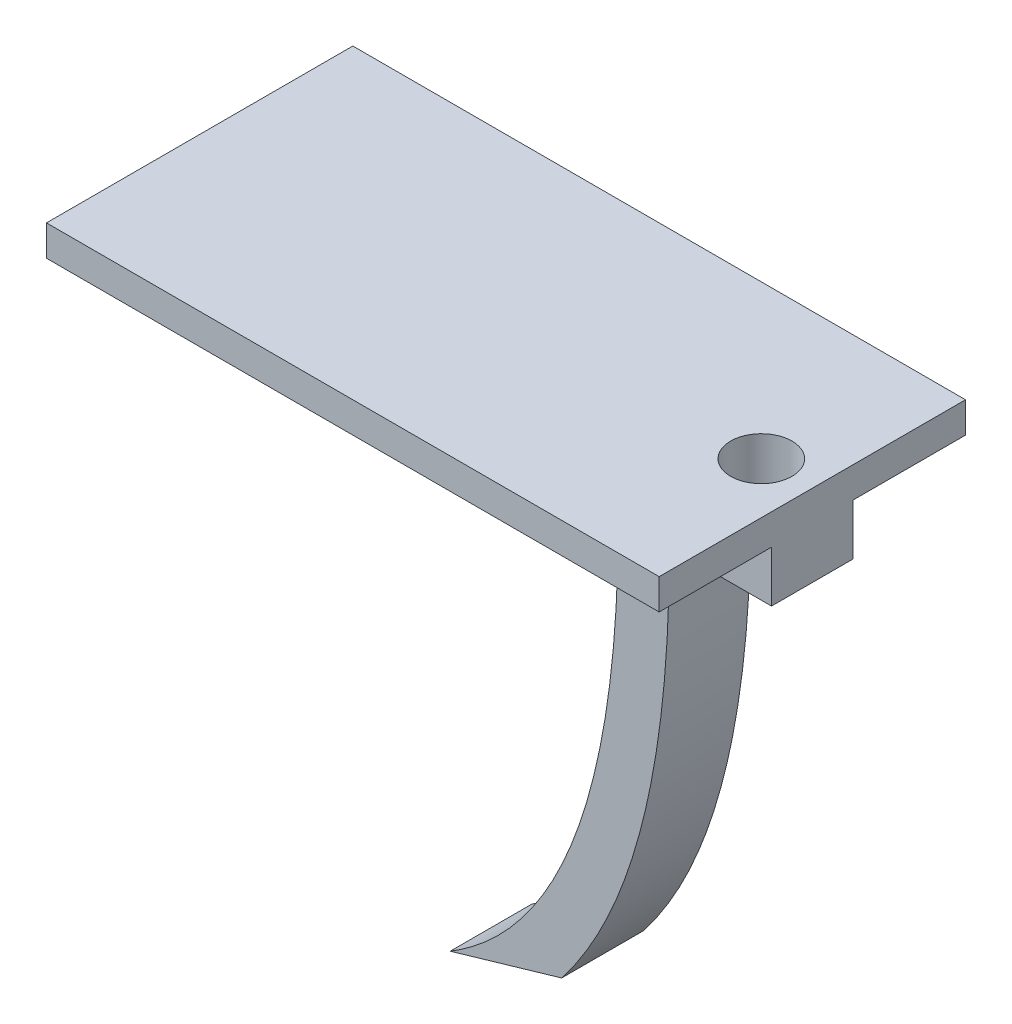
ISO-10303-21;
HEADER;
FILE_DESCRIPTION(('STEP AP214'),'2;1');
FILE_NAME('part.step','',(''),(''),'','','');
FILE_SCHEMA(('AUTOMOTIVE_DESIGN { 1 0 10303 214 1 1 1 1 }'));
ENDSEC;
DATA;
#1=APPLICATION_CONTEXT('core data for automotive mechanical design processes');
#2=APPLICATION_PROTOCOL_DEFINITION('international standard','automotive_design',2000,#1);
#3=PRODUCT_CONTEXT('',#1,'mechanical');
#4=PRODUCT('Part','Part','',(#3));
#5=PRODUCT_RELATED_PRODUCT_CATEGORY('part','',(#4));
#6=PRODUCT_DEFINITION_FORMATION('','',#4);
#7=PRODUCT_DEFINITION_CONTEXT('part definition',#1,'design');
#8=PRODUCT_DEFINITION('design','',#6,#7);
#9=PRODUCT_DEFINITION_SHAPE('','',#8);
#10=(LENGTH_UNIT() NAMED_UNIT(*) SI_UNIT(.MILLI.,.METRE.));
#11=(NAMED_UNIT(*) PLANE_ANGLE_UNIT() SI_UNIT($,.RADIAN.));
#12=(NAMED_UNIT(*) SI_UNIT($,.STERADIAN.) SOLID_ANGLE_UNIT());
#13=UNCERTAINTY_MEASURE_WITH_UNIT(LENGTH_MEASURE(1.E-05),#10,'distance_accuracy_value','');
#14=(GEOMETRIC_REPRESENTATION_CONTEXT(3) GLOBAL_UNCERTAINTY_ASSIGNED_CONTEXT((#13)) GLOBAL_UNIT_ASSIGNED_CONTEXT((#10,
#11,#12)) REPRESENTATION_CONTEXT('',''));
#15=CARTESIAN_POINT('',(0.,0.,0.));
#16=DIRECTION('',(0.,0.,1.));
#17=DIRECTION('',(1.,0.,0.));
#18=AXIS2_PLACEMENT_3D('',#15,#16,#17);
#19=CARTESIAN_POINT('',(20.0000000000017,2.85687025472644E-13,8.));
#20=CARTESIAN_POINT('',(20.0000000000017,-0.746108230917631,8.));
#21=CARTESIAN_POINT('',(19.988920632771,-2.24924380162013,8.));
#22=CARTESIAN_POINT('',(19.9222378712313,-5.16766695974469,8.));
#23=CARTESIAN_POINT('',(19.7549797981308,-8.71210314543152,8.));
#24=CARTESIAN_POINT('',(19.418395555301,-12.7821607544514,8.));
#25=CARTESIAN_POINT('',(18.7856392362467,-17.9733627474117,8.));
#26=CARTESIAN_POINT('',(17.6436358974673,-24.0214566580383,8.));
#27=CARTESIAN_POINT('',(15.6838246207657,-30.5843368041771,8.));
#28=CARTESIAN_POINT('',(13.0959183142866,-36.4498459385376,8.));
#29=CARTESIAN_POINT('',(8.74916418950321,-43.3101622539576,8.));
#30=CARTESIAN_POINT('',(4.43750224750601,-47.2647745701534,8.));
#31=CARTESIAN_POINT('',(1.12987064017376,-49.273588476404,8.));
#32=B_SPLINE_CURVE_WITH_KNOTS('',3,(#19,#20,#21,#22,#23,#24,#25,#26,#27,#28,#29,#30,#31),
.UNSPECIFIED.,.F.,.F.,(4,1,1,1,1,1,1,1,1,1,4),(0.,0.03125,0.0625,0.125,0.1875,0.25,0.375,0.5,
0.625,0.75,1.),.UNSPECIFIED.);
#33=DIRECTION('',(0.,0.,-1.));
#34=VECTOR('',#33,1.);
#35=SURFACE_OF_LINEAR_EXTRUSION('',#32,#34);
#36=CARTESIAN_POINT('',(20.0000000000017,3.03529895510736E-13,8.));
#37=VERTEX_POINT('',#36);
#38=CARTESIAN_POINT('',(9.44788574393022,-41.8145794293929,8.));
#39=VERTEX_POINT('',#38);
#40=EDGE_CURVE('E117',#37,#39,#32,.T.);
#41=ORIENTED_EDGE('',*,*,#40,.T.);
#42=DIRECTION('',(0.,0.,1.));
#43=VECTOR('',#42,1.);
#44=CARTESIAN_POINT('',(9.44788574393022,-41.8145794293929,-11.));
#45=LINE('',#44,#43);
#46=CARTESIAN_POINT('',(9.44788574393022,-41.8145794293929,0.));
#47=VERTEX_POINT('',#46);
#48=EDGE_CURVE('E202',#47,#39,#45,.T.);
#49=ORIENTED_EDGE('',*,*,#48,.F.);
#50=CARTESIAN_POINT('',(20.0000000000017,2.85687025472644E-13,0.));
#51=CARTESIAN_POINT('',(20.0000000000017,-0.746108230917631,0.));
#52=CARTESIAN_POINT('',(19.988920632771,-2.24924380162013,0.));
#53=CARTESIAN_POINT('',(19.9222378712313,-5.16766695974469,0.));
#54=CARTESIAN_POINT('',(19.7549797981308,-8.71210314543152,0.));
#55=CARTESIAN_POINT('',(19.418395555301,-12.7821607544514,0.));
#56=CARTESIAN_POINT('',(18.7856392362467,-17.9733627474117,0.));
#57=CARTESIAN_POINT('',(17.6436358974673,-24.0214566580383,0.));
#58=CARTESIAN_POINT('',(15.6838246207657,-30.5843368041771,0.));
#59=CARTESIAN_POINT('',(13.0959183142866,-36.4498459385376,0.));
#60=CARTESIAN_POINT('',(8.74916418950321,-43.3101622539576,0.));
#61=CARTESIAN_POINT('',(4.43750224750601,-47.2647745701534,0.));
#62=CARTESIAN_POINT('',(1.12987064017376,-49.273588476404,0.));
#63=B_SPLINE_CURVE_WITH_KNOTS('',3,(#50,#51,#52,#53,#54,#55,#56,#57,#58,#59,#60,#61,#62),
.UNSPECIFIED.,.F.,.F.,(4,1,1,1,1,1,1,1,1,1,4),(0.,0.03125,0.0625,0.125,0.1875,0.25,0.375,0.5,
0.625,0.75,1.),.UNSPECIFIED.);
#64=CARTESIAN_POINT('',(20.0000000000017,3.03529895510736E-13,0.));
#65=VERTEX_POINT('',#64);
#66=EDGE_CURVE('E161',#65,#47,#63,.T.);
#67=ORIENTED_EDGE('',*,*,#66,.F.);
#68=DIRECTION('',(0.,0.,-1.));
#69=VECTOR('',#68,1.);
#70=CARTESIAN_POINT('',(20.0000000000017,3.03529895510736E-13,8.));
#71=LINE('',#70,#69);
#72=EDGE_CURVE('E130',#37,#65,#71,.T.);
#73=ORIENTED_EDGE('',*,*,#72,.F.);
#74=EDGE_LOOP('',(#41,#49,#67,#73));
#75=FACE_BOUND('',#74,.T.);
#76=ADVANCED_FACE('F41',(#75),#35,.T.);
#77=CARTESIAN_POINT('',(0.,0.,8.));
#78=DIRECTION('',(0.,0.,1.));
#79=DIRECTION('',(1.,0.,0.));
#80=AXIS2_PLACEMENT_3D('',#77,#78,#79);
#81=PLANE('',#80);
#82=CARTESIAN_POINT('',(15.0000000000017,3.03529895511263E-13,8.));
#83=CARTESIAN_POINT('',(15.0000000000016,-34.9999999999997,8.));
#84=CARTESIAN_POINT('',(-1.46559493161567,-44.9999999999997,8.));
#85=B_SPLINE_CURVE_WITH_KNOTS('',2,(#82,#83,#84),.UNSPECIFIED.,.F.,.F.,(3,3),(0.,1.),.UNSPECIFIED.);
#86=CARTESIAN_POINT('',(15.0000000000017,3.03529895510737E-13,8.));
#87=VERTEX_POINT('',#86);
#88=CARTESIAN_POINT('',(-1.46559493161567,-44.9999999999997,8.));
#89=VERTEX_POINT('',#88);
#90=EDGE_CURVE('E100',#87,#89,#85,.T.);
#91=ORIENTED_EDGE('',*,*,#90,.T.);
#92=DIRECTION('',(0.959945080235453,0.280188227682303,0.));
#93=VECTOR('',#92,1.);
#94=CARTESIAN_POINT('',(11.9883818023932,-41.0730608719234,8.));
#95=LINE('',#94,#93);
#96=EDGE_CURVE('E208',#89,#39,#95,.T.);
#97=ORIENTED_EDGE('',*,*,#96,.T.);
#98=ORIENTED_EDGE('',*,*,#40,.F.);
#99=DIRECTION('',(1.,0.,0.));
#100=VECTOR('',#99,1.);
#101=CARTESIAN_POINT('',(0.,3.03529895510739E-13,8.));
#102=LINE('',#101,#100);
#103=CARTESIAN_POINT('',(30.0000000000017,3.03529895510735E-13,8.));
#104=VERTEX_POINT('',#103);
#105=EDGE_CURVE('E109',#37,#104,#102,.T.);
#106=ORIENTED_EDGE('',*,*,#105,.T.);
#107=DIRECTION('',(0.,1.,0.));
#108=VECTOR('',#107,1.);
#109=CARTESIAN_POINT('',(30.0000000000017,0.,8.));
#110=LINE('',#109,#108);
#111=CARTESIAN_POINT('',(30.0000000000017,5.0000000000003,8.));
#112=VERTEX_POINT('',#111);
#113=EDGE_CURVE('E113',#104,#112,#110,.T.);
#114=ORIENTED_EDGE('',*,*,#113,.T.);
#115=DIRECTION('',(1.,0.,0.));
#116=VECTOR('',#115,1.);
#117=CARTESIAN_POINT('',(0.,5.00000000000041,8.));
#118=LINE('',#117,#116);
#119=CARTESIAN_POINT('',(-29.9999999999983,5.00000000000052,8.));
#120=VERTEX_POINT('',#119);
#121=EDGE_CURVE('E139',#120,#112,#118,.T.);
#122=ORIENTED_EDGE('',*,*,#121,.F.);
#123=DIRECTION('',(0.,-1.,0.));
#124=VECTOR('',#123,1.);
#125=CARTESIAN_POINT('',(-29.9999999999983,0.,8.));
#126=LINE('',#125,#124);
#127=CARTESIAN_POINT('',(-29.9999999999983,3.03529895752389E-13,8.));
#128=VERTEX_POINT('',#127);
#129=EDGE_CURVE('E60',#120,#128,#126,.T.);
#130=ORIENTED_EDGE('',*,*,#129,.T.);
#131=EDGE_CURVE('E121',#128,#87,#102,.T.);
#132=ORIENTED_EDGE('',*,*,#131,.T.);
#133=EDGE_LOOP('',(#91,#97,#98,#106,#114,#122,#130,#132));
#134=FACE_BOUND('',#133,.T.);
#135=ADVANCED_FACE('F111',(#134),#81,.T.);
#136=CARTESIAN_POINT('',(0.,0.,0.));
#137=DIRECTION('',(0.,0.,1.));
#138=DIRECTION('',(1.,0.,0.));
#139=AXIS2_PLACEMENT_3D('',#136,#137,#138);
#140=PLANE('',#139);
#141=DIRECTION('',(0.959945080235453,0.280188227682303,0.));
#142=VECTOR('',#141,1.);
#143=CARTESIAN_POINT('',(11.9883818023932,-41.0730608719234,0.));
#144=LINE('',#143,#142);
#145=CARTESIAN_POINT('',(-1.46559493161567,-44.9999999999997,0.));
#146=VERTEX_POINT('',#145);
#147=EDGE_CURVE('E11',#146,#47,#144,.T.);
#148=ORIENTED_EDGE('',*,*,#147,.F.);
#149=CARTESIAN_POINT('',(15.0000000000017,3.03529895511263E-13,0.));
#150=CARTESIAN_POINT('',(15.0000000000016,-34.9999999999997,0.));
#151=CARTESIAN_POINT('',(-1.46559493161567,-44.9999999999997,0.));
#152=B_SPLINE_CURVE_WITH_KNOTS('',2,(#149,#150,#151),.UNSPECIFIED.,.F.,.F.,(3,3),(0.,1.),.UNSPECIFIED.);
#153=CARTESIAN_POINT('',(15.0000000000017,3.03529895510737E-13,0.));
#154=VERTEX_POINT('',#153);
#155=EDGE_CURVE('E154',#154,#146,#152,.T.);
#156=ORIENTED_EDGE('',*,*,#155,.F.);
#157=DIRECTION('',(1.,0.,0.));
#158=VECTOR('',#157,1.);
#159=CARTESIAN_POINT('',(0.,3.03529895510739E-13,0.));
#160=LINE('',#159,#158);
#161=CARTESIAN_POINT('',(-29.9999999999983,3.03529895752389E-13,0.));
#162=VERTEX_POINT('',#161);
#163=EDGE_CURVE('E150',#162,#154,#160,.T.);
#164=ORIENTED_EDGE('',*,*,#163,.F.);
#165=DIRECTION('',(0.,-1.,0.));
#166=VECTOR('',#165,1.);
#167=CARTESIAN_POINT('',(-29.9999999999983,0.,0.));
#168=LINE('',#167,#166);
#169=CARTESIAN_POINT('',(-29.9999999999983,5.00000000000052,0.));
#170=VERTEX_POINT('',#169);
#171=EDGE_CURVE('E87',#170,#162,#168,.T.);
#172=ORIENTED_EDGE('',*,*,#171,.F.);
#173=DIRECTION('',(1.,0.,0.));
#174=VECTOR('',#173,1.);
#175=CARTESIAN_POINT('',(0.,5.00000000000041,0.));
#176=LINE('',#175,#174);
#177=CARTESIAN_POINT('',(30.0000000000017,5.0000000000003,0.));
#178=VERTEX_POINT('',#177);
#179=EDGE_CURVE('E176',#170,#178,#176,.T.);
#180=ORIENTED_EDGE('',*,*,#179,.T.);
#181=DIRECTION('',(0.,1.,0.));
#182=VECTOR('',#181,1.);
#183=CARTESIAN_POINT('',(30.0000000000017,0.,0.));
#184=LINE('',#183,#182);
#185=CARTESIAN_POINT('',(30.0000000000017,3.03529895510735E-13,0.));
#186=VERTEX_POINT('',#185);
#187=EDGE_CURVE('E170',#186,#178,#184,.T.);
#188=ORIENTED_EDGE('',*,*,#187,.F.);
#189=EDGE_CURVE('E126',#65,#186,#160,.T.);
#190=ORIENTED_EDGE('',*,*,#189,.F.);
#191=ORIENTED_EDGE('',*,*,#66,.T.);
#192=EDGE_LOOP('',(#148,#156,#164,#172,#180,#188,#190,#191));
#193=FACE_BOUND('',#192,.T.);
#194=ADVANCED_FACE('F193',(#193),#140,.F.);
#195=CARTESIAN_POINT('',(0.,3.03529895510739E-13,8.));
#196=DIRECTION('',(0.,1.,0.));
#197=DIRECTION('',(-1.,0.,0.));
#198=AXIS2_PLACEMENT_3D('',#195,#196,#197);
#199=PLANE('',#198);
#200=ORIENTED_EDGE('',*,*,#163,.T.);
#201=DIRECTION('',(0.,0.,-1.));
#202=VECTOR('',#201,1.);
#203=CARTESIAN_POINT('',(15.0000000000017,3.03529895510737E-13,8.));
#204=LINE('',#203,#202);
#205=EDGE_CURVE('E52',#87,#154,#204,.T.);
#206=ORIENTED_EDGE('',*,*,#205,.F.);
#207=ORIENTED_EDGE('',*,*,#131,.F.);
#208=DIRECTION('',(0.,0.,-1.));
#209=VECTOR('',#208,1.);
#210=CARTESIAN_POINT('',(-29.9999999999983,3.03529895752389E-13,8.));
#211=LINE('',#210,#209);
#212=EDGE_CURVE('E131',#128,#162,#211,.T.);
#213=ORIENTED_EDGE('',*,*,#212,.T.);
#214=EDGE_LOOP('',(#200,#206,#207,#213));
#215=FACE_BOUND('',#214,.T.);
#216=ADVANCED_FACE('F191',(#215),#199,.F.);
#217=DIRECTION('',(0.,0.,-1.));
#218=VECTOR('',#217,1.);
#219=SURFACE_OF_LINEAR_EXTRUSION('',#85,#218);
#220=ORIENTED_EDGE('',*,*,#155,.T.);
#221=DIRECTION('',(0.,0.,-1.));
#222=VECTOR('',#221,1.);
#223=CARTESIAN_POINT('',(-1.46559493161567,-44.9999999999997,8.));
#224=LINE('',#223,#222);
#225=EDGE_CURVE('E185',#89,#146,#224,.T.);
#226=ORIENTED_EDGE('',*,*,#225,.F.);
#227=ORIENTED_EDGE('',*,*,#90,.F.);
#228=ORIENTED_EDGE('',*,*,#205,.T.);
#229=EDGE_LOOP('',(#220,#226,#227,#228));
#230=FACE_BOUND('',#229,.T.);
#231=ADVANCED_FACE('F43',(#230),#219,.F.);
#232=CARTESIAN_POINT('',(25.0000000000016,3.05311331771918E-13,4.));
#233=DIRECTION('',(0.,1.,0.));
#234=DIRECTION('',(-1.,0.,0.));
#235=AXIS2_PLACEMENT_3D('',#232,#233,#234);
#236=CIRCLE('',#235,2.99999999999999);
#237=CARTESIAN_POINT('',(22.0000000000017,3.05311331771919E-13,4.));
#238=VERTEX_POINT('',#237);
#239=EDGE_CURVE('E213',#238,#238,#236,.T.);
#240=ORIENTED_EDGE('',*,*,#239,.T.);
#241=EDGE_LOOP('',(#240));
#242=FACE_BOUND('',#241,.T.);
#243=ORIENTED_EDGE('',*,*,#189,.T.);
#244=DIRECTION('',(0.,0.,-1.));
#245=VECTOR('',#244,1.);
#246=CARTESIAN_POINT('',(30.0000000000017,3.03529895510735E-13,8.));
#247=LINE('',#246,#245);
#248=EDGE_CURVE('E123',#104,#186,#247,.T.);
#249=ORIENTED_EDGE('',*,*,#248,.F.);
#250=ORIENTED_EDGE('',*,*,#105,.F.);
#251=ORIENTED_EDGE('',*,*,#72,.T.);
#252=EDGE_LOOP('',(#243,#249,#250,#251));
#253=FACE_BOUND('',#252,.T.);
#254=ADVANCED_FACE('F124',(#242,#253),#199,.F.);
#255=CARTESIAN_POINT('',(30.0000000000017,0.,8.));
#256=DIRECTION('',(-1.,0.,0.));
#257=DIRECTION('',(0.,-1.,0.));
#258=AXIS2_PLACEMENT_3D('',#255,#256,#257);
#259=PLANE('',#258);
#260=ORIENTED_EDGE('',*,*,#187,.T.);
#261=DIRECTION('',(0.,0.,-1.));
#262=VECTOR('',#261,1.);
#263=CARTESIAN_POINT('',(30.0000000000017,5.0000000000003,19.));
#264=LINE('',#263,#262);
#265=CARTESIAN_POINT('',(30.0000000000017,5.0000000000003,-11.));
#266=VERTEX_POINT('',#265);
#267=EDGE_CURVE('E220',#178,#266,#264,.T.);
#268=ORIENTED_EDGE('',*,*,#267,.T.);
#269=DIRECTION('',(0.,-1.,0.));
#270=VECTOR('',#269,1.);
#271=CARTESIAN_POINT('',(30.0000000000017,8.0000000000003,-11.));
#272=LINE('',#271,#270);
#273=CARTESIAN_POINT('',(30.0000000000017,8.0000000000003,-11.));
#274=VERTEX_POINT('',#273);
#275=EDGE_CURVE('E155',#274,#266,#272,.T.);
#276=ORIENTED_EDGE('',*,*,#275,.F.);
#277=DIRECTION('',(0.,0.,-1.));
#278=VECTOR('',#277,1.);
#279=CARTESIAN_POINT('',(30.0000000000017,8.0000000000003,19.));
#280=LINE('',#279,#278);
#281=CARTESIAN_POINT('',(30.0000000000017,8.0000000000003,19.));
#282=VERTEX_POINT('',#281);
#283=EDGE_CURVE('E221',#282,#274,#280,.T.);
#284=ORIENTED_EDGE('',*,*,#283,.F.);
#285=DIRECTION('',(0.,-1.,0.));
#286=VECTOR('',#285,1.);
#287=CARTESIAN_POINT('',(30.0000000000017,8.0000000000003,19.));
#288=LINE('',#287,#286);
#289=CARTESIAN_POINT('',(30.0000000000017,5.0000000000003,19.));
#290=VERTEX_POINT('',#289);
#291=EDGE_CURVE('E238',#282,#290,#288,.T.);
#292=ORIENTED_EDGE('',*,*,#291,.T.);
#293=EDGE_CURVE('E137',#290,#112,#264,.T.);
#294=ORIENTED_EDGE('',*,*,#293,.T.);
#295=ORIENTED_EDGE('',*,*,#113,.F.);
#296=ORIENTED_EDGE('',*,*,#248,.T.);
#297=EDGE_LOOP('',(#260,#268,#276,#284,#292,#294,#295,#296));
#298=FACE_BOUND('',#297,.T.);
#299=ADVANCED_FACE('F134',(#298),#259,.F.);
#300=CARTESIAN_POINT('',(-29.9999999999983,0.,8.));
#301=DIRECTION('',(1.,0.,0.));
#302=DIRECTION('',(0.,0.,-1.));
#303=AXIS2_PLACEMENT_3D('',#300,#301,#302);
#304=PLANE('',#303);
#305=ORIENTED_EDGE('',*,*,#171,.T.);
#306=ORIENTED_EDGE('',*,*,#212,.F.);
#307=ORIENTED_EDGE('',*,*,#129,.F.);
#308=DIRECTION('',(0.,0.,1.));
#309=VECTOR('',#308,1.);
#310=CARTESIAN_POINT('',(-29.9999999999983,5.00000000000052,19.));
#311=LINE('',#310,#309);
#312=CARTESIAN_POINT('',(-29.9999999999983,5.00000000000052,19.));
#313=VERTEX_POINT('',#312);
#314=EDGE_CURVE('E245',#120,#313,#311,.T.);
#315=ORIENTED_EDGE('',*,*,#314,.T.);
#316=DIRECTION('',(0.,-1.,0.));
#317=VECTOR('',#316,1.);
#318=CARTESIAN_POINT('',(-29.9999999999983,8.00000000000052,19.));
#319=LINE('',#318,#317);
#320=CARTESIAN_POINT('',(-29.9999999999983,8.00000000000052,19.));
#321=VERTEX_POINT('',#320);
#322=EDGE_CURVE('E254',#321,#313,#319,.T.);
#323=ORIENTED_EDGE('',*,*,#322,.F.);
#324=DIRECTION('',(0.,0.,1.));
#325=VECTOR('',#324,1.);
#326=CARTESIAN_POINT('',(-29.9999999999983,8.00000000000052,19.));
#327=LINE('',#326,#325);
#328=CARTESIAN_POINT('',(-29.9999999999983,8.00000000000052,-11.));
#329=VERTEX_POINT('',#328);
#330=EDGE_CURVE('E230',#329,#321,#327,.T.);
#331=ORIENTED_EDGE('',*,*,#330,.F.);
#332=DIRECTION('',(0.,-1.,0.));
#333=VECTOR('',#332,1.);
#334=CARTESIAN_POINT('',(-29.9999999999983,8.00000000000052,-11.));
#335=LINE('',#334,#333);
#336=CARTESIAN_POINT('',(-29.9999999999983,5.00000000000052,-11.));
#337=VERTEX_POINT('',#336);
#338=EDGE_CURVE('E258',#329,#337,#335,.T.);
#339=ORIENTED_EDGE('',*,*,#338,.T.);
#340=EDGE_CURVE('E246',#337,#170,#311,.T.);
#341=ORIENTED_EDGE('',*,*,#340,.T.);
#342=EDGE_LOOP('',(#305,#306,#307,#315,#323,#331,#339,#341));
#343=FACE_BOUND('',#342,.T.);
#344=ADVANCED_FACE('F317',(#343),#304,.F.);
#345=CARTESIAN_POINT('',(0.,5.00000000000041,0.));
#346=DIRECTION('',(0.,-1.,0.));
#347=DIRECTION('',(1.,0.,0.));
#348=AXIS2_PLACEMENT_3D('',#345,#346,#347);
#349=PLANE('',#348);
#350=ORIENTED_EDGE('',*,*,#179,.F.);
#351=ORIENTED_EDGE('',*,*,#340,.F.);
#352=DIRECTION('',(-1.,0.,0.));
#353=VECTOR('',#352,1.);
#354=CARTESIAN_POINT('',(-29.9999999999983,5.00000000000052,-11.));
#355=LINE('',#354,#353);
#356=EDGE_CURVE('E241',#266,#337,#355,.T.);
#357=ORIENTED_EDGE('',*,*,#356,.F.);
#358=ORIENTED_EDGE('',*,*,#267,.F.);
#359=EDGE_LOOP('',(#350,#351,#357,#358));
#360=FACE_BOUND('',#359,.T.);
#361=ADVANCED_FACE('F310',(#360),#349,.T.);
#362=CARTESIAN_POINT('',(-29.9999999999983,8.00000000000052,-11.));
#363=DIRECTION('',(0.,0.,1.));
#364=DIRECTION('',(1.,0.,0.));
#365=AXIS2_PLACEMENT_3D('',#362,#363,#364);
#366=PLANE('',#365);
#367=ORIENTED_EDGE('',*,*,#356,.T.);
#368=ORIENTED_EDGE('',*,*,#338,.F.);
#369=DIRECTION('',(-1.,0.,0.));
#370=VECTOR('',#369,1.);
#371=CARTESIAN_POINT('',(-29.9999999999983,8.00000000000052,-11.));
#372=LINE('',#371,#370);
#373=EDGE_CURVE('E225',#274,#329,#372,.T.);
#374=ORIENTED_EDGE('',*,*,#373,.F.);
#375=ORIENTED_EDGE('',*,*,#275,.T.);
#376=EDGE_LOOP('',(#367,#368,#374,#375));
#377=FACE_BOUND('',#376,.T.);
#378=ADVANCED_FACE('F313',(#377),#366,.F.);
#379=CARTESIAN_POINT('',(-29.9999999999983,8.00000000000052,19.));
#380=DIRECTION('',(0.,0.,-1.));
#381=DIRECTION('',(-1.,0.,0.));
#382=AXIS2_PLACEMENT_3D('',#379,#380,#381);
#383=PLANE('',#382);
#384=DIRECTION('',(1.,0.,0.));
#385=VECTOR('',#384,1.);
#386=CARTESIAN_POINT('',(-29.9999999999983,5.00000000000052,19.));
#387=LINE('',#386,#385);
#388=EDGE_CURVE('E226',#313,#290,#387,.T.);
#389=ORIENTED_EDGE('',*,*,#388,.T.);
#390=ORIENTED_EDGE('',*,*,#291,.F.);
#391=DIRECTION('',(1.,0.,0.));
#392=VECTOR('',#391,1.);
#393=CARTESIAN_POINT('',(-29.9999999999983,8.00000000000052,19.));
#394=LINE('',#393,#392);
#395=EDGE_CURVE('E234',#321,#282,#394,.T.);
#396=ORIENTED_EDGE('',*,*,#395,.F.);
#397=ORIENTED_EDGE('',*,*,#322,.T.);
#398=EDGE_LOOP('',(#389,#390,#396,#397));
#399=FACE_BOUND('',#398,.T.);
#400=ADVANCED_FACE('F296',(#399),#383,.F.);
#401=CARTESIAN_POINT('',(0.,8.00000000000041,0.));
#402=DIRECTION('',(0.,-1.,0.));
#403=DIRECTION('',(1.,0.,0.));
#404=AXIS2_PLACEMENT_3D('',#401,#402,#403);
#405=PLANE('',#404);
#406=CARTESIAN_POINT('',(25.0000000000017,8.00000000000032,4.));
#407=DIRECTION('',(0.,1.,0.));
#408=DIRECTION('',(-1.,0.,0.));
#409=AXIS2_PLACEMENT_3D('',#406,#407,#408);
#410=CIRCLE('',#409,2.99999999999999);
#411=CARTESIAN_POINT('',(22.0000000000017,8.00000000000033,4.));
#412=VERTEX_POINT('',#411);
#413=EDGE_CURVE('E207',#412,#412,#410,.T.);
#414=ORIENTED_EDGE('',*,*,#413,.F.);
#415=EDGE_LOOP('',(#414));
#416=FACE_BOUND('',#415,.T.);
#417=ORIENTED_EDGE('',*,*,#283,.T.);
#418=ORIENTED_EDGE('',*,*,#373,.T.);
#419=ORIENTED_EDGE('',*,*,#330,.T.);
#420=ORIENTED_EDGE('',*,*,#395,.T.);
#421=EDGE_LOOP('',(#417,#418,#419,#420));
#422=FACE_BOUND('',#421,.T.);
#423=ADVANCED_FACE('F316',(#416,#422),#405,.F.);
#424=ORIENTED_EDGE('',*,*,#314,.F.);
#425=ORIENTED_EDGE('',*,*,#121,.T.);
#426=ORIENTED_EDGE('',*,*,#293,.F.);
#427=ORIENTED_EDGE('',*,*,#388,.F.);
#428=EDGE_LOOP('',(#424,#425,#426,#427));
#429=FACE_BOUND('',#428,.T.);
#430=ADVANCED_FACE('F303',(#429),#349,.T.);
#431=CARTESIAN_POINT('',(25.0000000000015,-49.2735884764042,4.));
#432=DIRECTION('',(0.,1.,0.));
#433=DIRECTION('',(-1.,0.,0.));
#434=AXIS2_PLACEMENT_3D('',#431,#432,#433);
#435=CYLINDRICAL_SURFACE('',#434,2.99999999999999);
#436=ORIENTED_EDGE('',*,*,#413,.T.);
#437=EDGE_LOOP('',(#436));
#438=FACE_BOUND('',#437,.T.);
#439=ORIENTED_EDGE('',*,*,#239,.F.);
#440=EDGE_LOOP('',(#439));
#441=FACE_BOUND('',#440,.T.);
#442=ADVANCED_FACE('F350',(#438,#441),#435,.F.);
#443=CARTESIAN_POINT('',(11.9883818023932,-41.0730608719234,-11.));
#444=DIRECTION('',(0.280188227682303,-0.959945080235453,0.));
#445=DIRECTION('',(0.959945080235453,0.280188227682303,0.));
#446=AXIS2_PLACEMENT_3D('',#443,#444,#445);
#447=PLANE('',#446);
#448=ORIENTED_EDGE('',*,*,#147,.T.);
#449=ORIENTED_EDGE('',*,*,#48,.T.);
#450=ORIENTED_EDGE('',*,*,#96,.F.);
#451=ORIENTED_EDGE('',*,*,#225,.T.);
#452=EDGE_LOOP('',(#448,#449,#450,#451));
#453=FACE_BOUND('',#452,.T.);
#454=ADVANCED_FACE('F199',(#453),#447,.T.);
#455=CLOSED_SHELL('',(#76,#135,#194,#216,#231,#254,#299,#344,#361,#378,#400,#423,#430,#442,#454));
#456=MANIFOLD_SOLID_BREP('B2',#455);
#457=ADVANCED_BREP_SHAPE_REPRESENTATION('',(#18,#456),#14);
#458=SHAPE_DEFINITION_REPRESENTATION(#9,#457);
ENDSEC;
END-ISO-10303-21;
